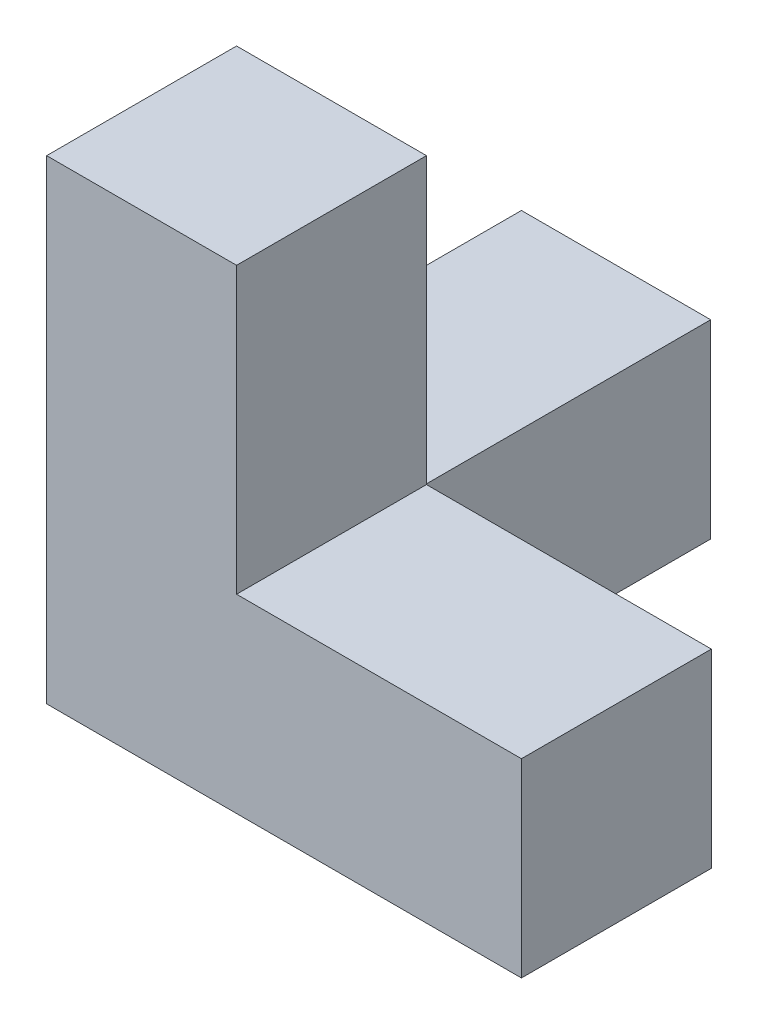
ISO-10303-21;
HEADER;
FILE_DESCRIPTION(('STEP AP214'),'2;1');
FILE_NAME('part.step','',(''),(''),'','','');
FILE_SCHEMA(('AUTOMOTIVE_DESIGN { 1 0 10303 214 1 1 1 1 }'));
ENDSEC;
DATA;
#1=APPLICATION_CONTEXT('core data for automotive mechanical design processes');
#2=APPLICATION_PROTOCOL_DEFINITION('international standard','automotive_design',2000,#1);
#3=PRODUCT_CONTEXT('',#1,'mechanical');
#4=PRODUCT('Part','Part','',(#3));
#5=PRODUCT_RELATED_PRODUCT_CATEGORY('part','',(#4));
#6=PRODUCT_DEFINITION_FORMATION('','',#4);
#7=PRODUCT_DEFINITION_CONTEXT('part definition',#1,'design');
#8=PRODUCT_DEFINITION('design','',#6,#7);
#9=PRODUCT_DEFINITION_SHAPE('','',#8);
#10=(LENGTH_UNIT() NAMED_UNIT(*) SI_UNIT(.MILLI.,.METRE.));
#11=(NAMED_UNIT(*) PLANE_ANGLE_UNIT() SI_UNIT($,.RADIAN.));
#12=(NAMED_UNIT(*) SI_UNIT($,.STERADIAN.) SOLID_ANGLE_UNIT());
#13=UNCERTAINTY_MEASURE_WITH_UNIT(LENGTH_MEASURE(1.E-05),#10,'distance_accuracy_value','');
#14=(GEOMETRIC_REPRESENTATION_CONTEXT(3) GLOBAL_UNCERTAINTY_ASSIGNED_CONTEXT((#13)) GLOBAL_UNIT_ASSIGNED_CONTEXT((#10,
#11,#12)) REPRESENTATION_CONTEXT('',''));
#15=CARTESIAN_POINT('',(0.,0.,0.));
#16=DIRECTION('',(0.,0.,1.));
#17=DIRECTION('',(1.,0.,0.));
#18=AXIS2_PLACEMENT_3D('',#15,#16,#17);
#19=CARTESIAN_POINT('',(0.,0.,0.));
#20=DIRECTION('',(0.,0.,1.));
#21=DIRECTION('',(1.,0.,0.));
#22=AXIS2_PLACEMENT_3D('',#19,#20,#21);
#23=PLANE('',#22);
#24=DIRECTION('',(0.,1.,0.));
#25=VECTOR('',#24,1.);
#26=CARTESIAN_POINT('',(-89.7924982935027,14.9845679012346,0.));
#27=LINE('',#26,#25);
#28=CARTESIAN_POINT('',(-89.7924982935027,-5.01543209876544,0.));
#29=VERTEX_POINT('',#28);
#30=CARTESIAN_POINT('',(-89.7924982935027,14.9845679012346,0.));
#31=VERTEX_POINT('',#30);
#32=EDGE_CURVE('E132',#29,#31,#27,.T.);
#33=ORIENTED_EDGE('',*,*,#32,.F.);
#34=DIRECTION('',(1.,0.,0.));
#35=VECTOR('',#34,1.);
#36=CARTESIAN_POINT('',(-109.722222222222,-5.01543209876544,0.));
#37=LINE('',#36,#35);
#38=CARTESIAN_POINT('',(-109.722222222222,-5.01543209876544,0.));
#39=VERTEX_POINT('',#38);
#40=EDGE_CURVE('E157',#39,#29,#37,.T.);
#41=ORIENTED_EDGE('',*,*,#40,.F.);
#42=DIRECTION('',(0.,-1.,0.));
#43=VECTOR('',#42,1.);
#44=CARTESIAN_POINT('',(-109.722222222222,44.9845679012346,0.));
#45=LINE('',#44,#43);
#46=CARTESIAN_POINT('',(-109.722222222222,14.9845679012346,0.));
#47=VERTEX_POINT('',#46);
#48=EDGE_CURVE('E147',#47,#39,#45,.T.);
#49=ORIENTED_EDGE('',*,*,#48,.F.);
#50=DIRECTION('',(1.,0.,0.));
#51=VECTOR('',#50,1.);
#52=CARTESIAN_POINT('',(-89.7222222222222,14.9845679012346,0.));
#53=LINE('',#52,#51);
#54=EDGE_CURVE('E139',#47,#31,#53,.T.);
#55=ORIENTED_EDGE('',*,*,#54,.T.);
#56=EDGE_LOOP('',(#33,#41,#49,#55));
#57=FACE_BOUND('',#56,.T.);
#58=ADVANCED_FACE('F33',(#57),#23,.F.);
#59=CARTESIAN_POINT('',(-89.7222222222222,14.9845679012346,220.753175473055));
#60=DIRECTION('',(0.,1.,0.));
#61=DIRECTION('',(0.,0.,1.));
#62=AXIS2_PLACEMENT_3D('',#59,#60,#61);
#63=PLANE('',#62);
#64=DIRECTION('',(0.,0.,1.));
#65=VECTOR('',#64,1.);
#66=CARTESIAN_POINT('',(-89.7924982935027,14.9845679012346,-108.253175473055));
#67=LINE('',#66,#65);
#68=CARTESIAN_POINT('',(-89.7924982935027,14.9845679012346,30.));
#69=VERTEX_POINT('',#68);
#70=EDGE_CURVE('E128',#31,#69,#67,.T.);
#71=ORIENTED_EDGE('',*,*,#70,.F.);
#72=ORIENTED_EDGE('',*,*,#54,.F.);
#73=DIRECTION('',(0.,0.,1.));
#74=VECTOR('',#73,1.);
#75=CARTESIAN_POINT('',(-109.722222222222,14.9845679012346,-170.753175473055));
#76=LINE('',#75,#74);
#77=CARTESIAN_POINT('',(-109.722222222222,14.9845679012346,30.));
#78=VERTEX_POINT('',#77);
#79=EDGE_CURVE('E135',#47,#78,#76,.T.);
#80=ORIENTED_EDGE('',*,*,#79,.T.);
#81=DIRECTION('',(1.,0.,0.));
#82=VECTOR('',#81,1.);
#83=CARTESIAN_POINT('',(-89.7222222222222,14.9845679012346,30.));
#84=LINE('',#83,#82);
#85=EDGE_CURVE('E133',#78,#69,#84,.T.);
#86=ORIENTED_EDGE('',*,*,#85,.T.);
#87=EDGE_LOOP('',(#71,#72,#80,#86));
#88=FACE_BOUND('',#87,.T.);
#89=ADVANCED_FACE('F184',(#88),#63,.T.);
#90=CARTESIAN_POINT('',(-109.722222222222,44.9845679012346,50.));
#91=DIRECTION('',(1.,0.,0.));
#92=DIRECTION('',(0.,0.,-1.));
#93=AXIS2_PLACEMENT_3D('',#90,#91,#92);
#94=PLANE('',#93);
#95=ORIENTED_EDGE('',*,*,#79,.F.);
#96=ORIENTED_EDGE('',*,*,#48,.T.);
#97=DIRECTION('',(0.,0.,-1.));
#98=VECTOR('',#97,1.);
#99=CARTESIAN_POINT('',(-109.722222222222,-5.01543209876544,50.));
#100=LINE('',#99,#98);
#101=CARTESIAN_POINT('',(-109.722222222222,-5.01543209876544,50.));
#102=VERTEX_POINT('',#101);
#103=EDGE_CURVE('E41',#102,#39,#100,.T.);
#104=ORIENTED_EDGE('',*,*,#103,.F.);
#105=DIRECTION('',(0.,-1.,0.));
#106=VECTOR('',#105,1.);
#107=CARTESIAN_POINT('',(-109.722222222222,44.9845679012346,50.));
#108=LINE('',#107,#106);
#109=CARTESIAN_POINT('',(-109.722222222222,44.9845679012346,50.));
#110=VERTEX_POINT('',#109);
#111=EDGE_CURVE('E159',#110,#102,#108,.T.);
#112=ORIENTED_EDGE('',*,*,#111,.F.);
#113=DIRECTION('',(0.,0.,-1.));
#114=VECTOR('',#113,1.);
#115=CARTESIAN_POINT('',(-109.722222222222,44.9845679012346,50.));
#116=LINE('',#115,#114);
#117=CARTESIAN_POINT('',(-109.722222222222,44.9845679012346,30.));
#118=VERTEX_POINT('',#117);
#119=EDGE_CURVE('E11',#110,#118,#116,.T.);
#120=ORIENTED_EDGE('',*,*,#119,.T.);
#121=DIRECTION('',(0.,-1.,0.));
#122=VECTOR('',#121,1.);
#123=CARTESIAN_POINT('',(-109.722222222222,44.9845679012346,30.));
#124=LINE('',#123,#122);
#125=EDGE_CURVE('E136',#118,#78,#124,.T.);
#126=ORIENTED_EDGE('',*,*,#125,.T.);
#127=EDGE_LOOP('',(#95,#96,#104,#112,#120,#126));
#128=FACE_BOUND('',#127,.T.);
#129=ADVANCED_FACE('F188',(#128),#94,.F.);
#130=CARTESIAN_POINT('',(-59.7222222222222,44.9845679012346,50.));
#131=DIRECTION('',(-1.,0.,0.));
#132=DIRECTION('',(0.,0.,1.));
#133=AXIS2_PLACEMENT_3D('',#130,#131,#132);
#134=PLANE('',#133);
#135=DIRECTION('',(0.,0.,-1.));
#136=VECTOR('',#135,1.);
#137=CARTESIAN_POINT('',(-59.7222222222222,-5.01543209876544,50.));
#138=LINE('',#137,#136);
#139=CARTESIAN_POINT('',(-59.7222222222222,-5.01543209876544,50.));
#140=VERTEX_POINT('',#139);
#141=CARTESIAN_POINT('',(-59.7222222222222,-5.01543209876544,30.));
#142=VERTEX_POINT('',#141);
#143=EDGE_CURVE('E119',#140,#142,#138,.T.);
#144=ORIENTED_EDGE('',*,*,#143,.T.);
#145=DIRECTION('',(0.,1.,0.));
#146=VECTOR('',#145,1.);
#147=CARTESIAN_POINT('',(-59.7222222222222,44.9845679012346,30.));
#148=LINE('',#147,#146);
#149=CARTESIAN_POINT('',(-59.7222222222222,14.9845679012346,30.));
#150=VERTEX_POINT('',#149);
#151=EDGE_CURVE('E118',#142,#150,#148,.T.);
#152=ORIENTED_EDGE('',*,*,#151,.T.);
#153=DIRECTION('',(0.,0.,-1.));
#154=VECTOR('',#153,1.);
#155=CARTESIAN_POINT('',(-59.7222222222222,14.9845679012346,220.753175473055));
#156=LINE('',#155,#154);
#157=CARTESIAN_POINT('',(-59.7222222222222,14.9845679012346,50.));
#158=VERTEX_POINT('',#157);
#159=EDGE_CURVE('E103',#158,#150,#156,.T.);
#160=ORIENTED_EDGE('',*,*,#159,.F.);
#161=DIRECTION('',(0.,1.,0.));
#162=VECTOR('',#161,1.);
#163=CARTESIAN_POINT('',(-59.7222222222222,44.9845679012346,50.));
#164=LINE('',#163,#162);
#165=EDGE_CURVE('E154',#140,#158,#164,.T.);
#166=ORIENTED_EDGE('',*,*,#165,.F.);
#167=EDGE_LOOP('',(#144,#152,#160,#166));
#168=FACE_BOUND('',#167,.T.);
#169=ADVANCED_FACE('F35',(#168),#134,.F.);
#170=CARTESIAN_POINT('',(-109.722222222222,44.9845679012346,50.));
#171=DIRECTION('',(0.,-1.,0.));
#172=DIRECTION('',(0.,0.,-1.));
#173=AXIS2_PLACEMENT_3D('',#170,#171,#172);
#174=PLANE('',#173);
#175=DIRECTION('',(0.,0.,-1.));
#176=VECTOR('',#175,1.);
#177=CARTESIAN_POINT('',(-89.7222222222222,44.9845679012346,220.753175473055));
#178=LINE('',#177,#176);
#179=CARTESIAN_POINT('',(-89.7222222222222,44.9845679012346,50.));
#180=VERTEX_POINT('',#179);
#181=CARTESIAN_POINT('',(-89.7222222222222,44.9845679012346,30.));
#182=VERTEX_POINT('',#181);
#183=EDGE_CURVE('E115',#180,#182,#178,.T.);
#184=ORIENTED_EDGE('',*,*,#183,.T.);
#185=DIRECTION('',(-1.,0.,0.));
#186=VECTOR('',#185,1.);
#187=CARTESIAN_POINT('',(-109.722222222222,44.9845679012346,30.));
#188=LINE('',#187,#186);
#189=EDGE_CURVE('E140',#182,#118,#188,.T.);
#190=ORIENTED_EDGE('',*,*,#189,.T.);
#191=ORIENTED_EDGE('',*,*,#119,.F.);
#192=DIRECTION('',(-1.,0.,0.));
#193=VECTOR('',#192,1.);
#194=CARTESIAN_POINT('',(-109.722222222222,44.9845679012346,50.));
#195=LINE('',#194,#193);
#196=EDGE_CURVE('E156',#180,#110,#195,.T.);
#197=ORIENTED_EDGE('',*,*,#196,.F.);
#198=EDGE_LOOP('',(#184,#190,#191,#197));
#199=FACE_BOUND('',#198,.T.);
#200=ADVANCED_FACE('F192',(#199),#174,.F.);
#201=CARTESIAN_POINT('',(-109.722222222222,-5.01543209876544,50.));
#202=DIRECTION('',(0.,1.,0.));
#203=DIRECTION('',(0.,0.,1.));
#204=AXIS2_PLACEMENT_3D('',#201,#202,#203);
#205=PLANE('',#204);
#206=ORIENTED_EDGE('',*,*,#40,.T.);
#207=DIRECTION('',(0.,0.,1.));
#208=VECTOR('',#207,1.);
#209=CARTESIAN_POINT('',(-89.7924982935027,-5.01543209876544,-108.253175473055));
#210=LINE('',#209,#208);
#211=CARTESIAN_POINT('',(-89.7924982935027,-5.01543209876544,30.));
#212=VERTEX_POINT('',#211);
#213=EDGE_CURVE('E48',#29,#212,#210,.T.);
#214=ORIENTED_EDGE('',*,*,#213,.T.);
#215=DIRECTION('',(1.,0.,0.));
#216=VECTOR('',#215,1.);
#217=CARTESIAN_POINT('',(-109.722222222222,-5.01543209876544,30.));
#218=LINE('',#217,#216);
#219=EDGE_CURVE('E52',#212,#142,#218,.T.);
#220=ORIENTED_EDGE('',*,*,#219,.T.);
#221=ORIENTED_EDGE('',*,*,#143,.F.);
#222=DIRECTION('',(1.,0.,0.));
#223=VECTOR('',#222,1.);
#224=CARTESIAN_POINT('',(-109.722222222222,-5.01543209876544,50.));
#225=LINE('',#224,#223);
#226=EDGE_CURVE('E161',#102,#140,#225,.T.);
#227=ORIENTED_EDGE('',*,*,#226,.F.);
#228=ORIENTED_EDGE('',*,*,#103,.T.);
#229=EDGE_LOOP('',(#206,#214,#220,#221,#227,#228));
#230=FACE_BOUND('',#229,.T.);
#231=ADVANCED_FACE('F169',(#230),#205,.F.);
#232=CARTESIAN_POINT('',(0.,0.,50.));
#233=DIRECTION('',(0.,0.,1.));
#234=DIRECTION('',(1.,0.,0.));
#235=AXIS2_PLACEMENT_3D('',#232,#233,#234);
#236=PLANE('',#235);
#237=DIRECTION('',(1.,0.,0.));
#238=VECTOR('',#237,1.);
#239=CARTESIAN_POINT('',(-89.7222222222222,14.9845679012346,50.));
#240=LINE('',#239,#238);
#241=CARTESIAN_POINT('',(-89.7222222222222,14.9845679012346,50.));
#242=VERTEX_POINT('',#241);
#243=EDGE_CURVE('E110',#242,#158,#240,.T.);
#244=ORIENTED_EDGE('',*,*,#243,.F.);
#245=DIRECTION('',(0.,-1.,0.));
#246=VECTOR('',#245,1.);
#247=CARTESIAN_POINT('',(-89.7222222222222,44.9845679012346,50.));
#248=LINE('',#247,#246);
#249=EDGE_CURVE('E144',#180,#242,#248,.T.);
#250=ORIENTED_EDGE('',*,*,#249,.F.);
#251=ORIENTED_EDGE('',*,*,#196,.T.);
#252=ORIENTED_EDGE('',*,*,#111,.T.);
#253=ORIENTED_EDGE('',*,*,#226,.T.);
#254=ORIENTED_EDGE('',*,*,#165,.T.);
#255=EDGE_LOOP('',(#244,#250,#251,#252,#253,#254));
#256=FACE_BOUND('',#255,.T.);
#257=ADVANCED_FACE('F197',(#256),#236,.T.);
#258=DIRECTION('',(1.,0.,0.));
#259=VECTOR('',#258,1.);
#260=CARTESIAN_POINT('',(-89.7222222222222,14.9845679012346,30.));
#261=LINE('',#260,#259);
#262=CARTESIAN_POINT('',(-89.7222222222222,14.9845679012346,30.));
#263=VERTEX_POINT('',#262);
#264=EDGE_CURVE('E108',#263,#150,#261,.T.);
#265=ORIENTED_EDGE('',*,*,#264,.F.);
#266=DIRECTION('',(0.,0.,-1.));
#267=VECTOR('',#266,1.);
#268=CARTESIAN_POINT('',(-89.7222222222222,14.9845679012346,220.753175473055));
#269=LINE('',#268,#267);
#270=EDGE_CURVE('E114',#242,#263,#269,.T.);
#271=ORIENTED_EDGE('',*,*,#270,.F.);
#272=ORIENTED_EDGE('',*,*,#243,.T.);
#273=ORIENTED_EDGE('',*,*,#159,.T.);
#274=EDGE_LOOP('',(#265,#271,#272,#273));
#275=FACE_BOUND('',#274,.T.);
#276=ADVANCED_FACE('F105',(#275),#63,.T.);
#277=CARTESIAN_POINT('',(-89.7222222222222,44.9845679012346,220.753175473055));
#278=DIRECTION('',(1.,0.,0.));
#279=DIRECTION('',(0.,0.,-1.));
#280=AXIS2_PLACEMENT_3D('',#277,#278,#279);
#281=PLANE('',#280);
#282=DIRECTION('',(0.,-1.,0.));
#283=VECTOR('',#282,1.);
#284=CARTESIAN_POINT('',(-89.7222222222222,44.9845679012346,30.));
#285=LINE('',#284,#283);
#286=EDGE_CURVE('E125',#182,#263,#285,.T.);
#287=ORIENTED_EDGE('',*,*,#286,.F.);
#288=ORIENTED_EDGE('',*,*,#183,.F.);
#289=ORIENTED_EDGE('',*,*,#249,.T.);
#290=ORIENTED_EDGE('',*,*,#270,.T.);
#291=EDGE_LOOP('',(#287,#288,#289,#290));
#292=FACE_BOUND('',#291,.T.);
#293=ADVANCED_FACE('F195',(#292),#281,.T.);
#294=CARTESIAN_POINT('',(0.,0.,30.));
#295=DIRECTION('',(0.,0.,1.));
#296=DIRECTION('',(1.,0.,0.));
#297=AXIS2_PLACEMENT_3D('',#294,#295,#296);
#298=PLANE('',#297);
#299=ORIENTED_EDGE('',*,*,#286,.T.);
#300=ORIENTED_EDGE('',*,*,#264,.T.);
#301=ORIENTED_EDGE('',*,*,#151,.F.);
#302=ORIENTED_EDGE('',*,*,#219,.F.);
#303=DIRECTION('',(0.,1.,0.));
#304=VECTOR('',#303,1.);
#305=CARTESIAN_POINT('',(-89.7924982935027,14.9845679012346,30.));
#306=LINE('',#305,#304);
#307=EDGE_CURVE('E177',#212,#69,#306,.T.);
#308=ORIENTED_EDGE('',*,*,#307,.T.);
#309=ORIENTED_EDGE('',*,*,#85,.F.);
#310=ORIENTED_EDGE('',*,*,#125,.F.);
#311=ORIENTED_EDGE('',*,*,#189,.F.);
#312=EDGE_LOOP('',(#299,#300,#301,#302,#308,#309,#310,#311));
#313=FACE_BOUND('',#312,.T.);
#314=ADVANCED_FACE('F123',(#313),#298,.F.);
#315=CARTESIAN_POINT('',(-89.7924982935027,14.9845679012346,-108.253175473055));
#316=DIRECTION('',(-1.,0.,0.));
#317=DIRECTION('',(0.,0.,1.));
#318=AXIS2_PLACEMENT_3D('',#315,#316,#317);
#319=PLANE('',#318);
#320=ORIENTED_EDGE('',*,*,#32,.T.);
#321=ORIENTED_EDGE('',*,*,#70,.T.);
#322=ORIENTED_EDGE('',*,*,#307,.F.);
#323=ORIENTED_EDGE('',*,*,#213,.F.);
#324=EDGE_LOOP('',(#320,#321,#322,#323));
#325=FACE_BOUND('',#324,.T.);
#326=ADVANCED_FACE('F182',(#325),#319,.F.);
#327=CLOSED_SHELL('',(#58,#89,#129,#169,#200,#231,#257,#276,#293,#314,#326));
#328=MANIFOLD_SOLID_BREP('B2',#327);
#329=ADVANCED_BREP_SHAPE_REPRESENTATION('',(#18,#328),#14);
#330=SHAPE_DEFINITION_REPRESENTATION(#9,#329);
ENDSEC;
END-ISO-10303-21;
